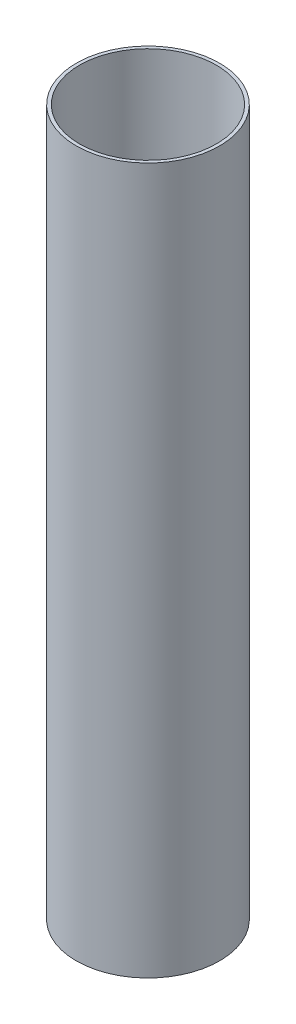
ISO-10303-21;
HEADER;
FILE_DESCRIPTION(('STEP AP214'),'2;1');
FILE_NAME('part.step','',(''),(''),'','','');
FILE_SCHEMA(('AUTOMOTIVE_DESIGN { 1 0 10303 214 1 1 1 1 }'));
ENDSEC;
DATA;
#1=APPLICATION_CONTEXT('core data for automotive mechanical design processes');
#2=APPLICATION_PROTOCOL_DEFINITION('international standard','automotive_design',2000,#1);
#3=PRODUCT_CONTEXT('',#1,'mechanical');
#4=PRODUCT('Part','Part','',(#3));
#5=PRODUCT_RELATED_PRODUCT_CATEGORY('part','',(#4));
#6=PRODUCT_DEFINITION_FORMATION('','',#4);
#7=PRODUCT_DEFINITION_CONTEXT('part definition',#1,'design');
#8=PRODUCT_DEFINITION('design','',#6,#7);
#9=PRODUCT_DEFINITION_SHAPE('','',#8);
#10=(LENGTH_UNIT() NAMED_UNIT(*) SI_UNIT(.MILLI.,.METRE.));
#11=(NAMED_UNIT(*) PLANE_ANGLE_UNIT() SI_UNIT($,.RADIAN.));
#12=(NAMED_UNIT(*) SI_UNIT($,.STERADIAN.) SOLID_ANGLE_UNIT());
#13=UNCERTAINTY_MEASURE_WITH_UNIT(LENGTH_MEASURE(1.E-05),#10,'distance_accuracy_value','');
#14=(GEOMETRIC_REPRESENTATION_CONTEXT(3) GLOBAL_UNCERTAINTY_ASSIGNED_CONTEXT((#13)) GLOBAL_UNIT_ASSIGNED_CONTEXT((#10,
#11,#12)) REPRESENTATION_CONTEXT('',''));
#15=CARTESIAN_POINT('',(0.,0.,0.));
#16=DIRECTION('',(0.,0.,1.));
#17=DIRECTION('',(1.,0.,0.));
#18=AXIS2_PLACEMENT_3D('',#15,#16,#17);
#19=CARTESIAN_POINT('',(0.,320.,0.));
#20=DIRECTION('',(0.,-1.,0.));
#21=DIRECTION('',(0.,0.,-1.));
#22=AXIS2_PLACEMENT_3D('',#19,#20,#21);
#23=CYLINDRICAL_SURFACE('',#22,32.5);
#24=CARTESIAN_POINT('',(0.,320.,0.));
#25=DIRECTION('',(0.,1.,0.));
#26=DIRECTION('',(0.,0.,1.));
#27=AXIS2_PLACEMENT_3D('',#24,#25,#26);
#28=CIRCLE('',#27,32.5);
#29=CARTESIAN_POINT('',(0.,320.,32.5));
#30=VERTEX_POINT('',#29);
#31=EDGE_CURVE('E10',#30,#30,#28,.T.);
#32=ORIENTED_EDGE('',*,*,#31,.F.);
#33=EDGE_LOOP('',(#32));
#34=FACE_BOUND('',#33,.T.);
#35=CARTESIAN_POINT('',(0.,0.,0.));
#36=DIRECTION('',(0.,1.,0.));
#37=DIRECTION('',(0.,0.,1.));
#38=AXIS2_PLACEMENT_3D('',#35,#36,#37);
#39=CIRCLE('',#38,32.5);
#40=CARTESIAN_POINT('',(0.,0.,32.5));
#41=VERTEX_POINT('',#40);
#42=EDGE_CURVE('E41',#41,#41,#39,.T.);
#43=ORIENTED_EDGE('',*,*,#42,.T.);
#44=EDGE_LOOP('',(#43));
#45=FACE_BOUND('',#44,.T.);
#46=ADVANCED_FACE('F38',(#34,#45),#23,.T.);
#47=CARTESIAN_POINT('',(0.,320.,0.));
#48=DIRECTION('',(0.,1.,0.));
#49=DIRECTION('',(0.,0.,1.));
#50=AXIS2_PLACEMENT_3D('',#47,#48,#49);
#51=PLANE('',#50);
#52=CARTESIAN_POINT('',(0.,320.,0.));
#53=DIRECTION('',(0.,1.,0.));
#54=DIRECTION('',(0.,0.,1.));
#55=AXIS2_PLACEMENT_3D('',#52,#53,#54);
#56=CIRCLE('',#55,31.);
#57=CARTESIAN_POINT('',(0.,320.,31.));
#58=VERTEX_POINT('',#57);
#59=EDGE_CURVE('E50',#58,#58,#56,.T.);
#60=ORIENTED_EDGE('',*,*,#59,.F.);
#61=EDGE_LOOP('',(#60));
#62=FACE_BOUND('',#61,.T.);
#63=ORIENTED_EDGE('',*,*,#31,.T.);
#64=EDGE_LOOP('',(#63));
#65=FACE_BOUND('',#64,.T.);
#66=ADVANCED_FACE('F65',(#62,#65),#51,.T.);
#67=CARTESIAN_POINT('',(0.,0.,0.));
#68=DIRECTION('',(0.,1.,0.));
#69=DIRECTION('',(0.,0.,1.));
#70=AXIS2_PLACEMENT_3D('',#67,#68,#69);
#71=PLANE('',#70);
#72=CARTESIAN_POINT('',(0.,0.,0.));
#73=DIRECTION('',(0.,1.,0.));
#74=DIRECTION('',(0.,0.,1.));
#75=AXIS2_PLACEMENT_3D('',#72,#73,#74);
#76=CIRCLE('',#75,31.);
#77=CARTESIAN_POINT('',(0.,0.,31.));
#78=VERTEX_POINT('',#77);
#79=EDGE_CURVE('E48',#78,#78,#76,.T.);
#80=ORIENTED_EDGE('',*,*,#79,.T.);
#81=EDGE_LOOP('',(#80));
#82=FACE_BOUND('',#81,.T.);
#83=ORIENTED_EDGE('',*,*,#42,.F.);
#84=EDGE_LOOP('',(#83));
#85=FACE_BOUND('',#84,.T.);
#86=ADVANCED_FACE('F56',(#82,#85),#71,.F.);
#87=CARTESIAN_POINT('',(0.,0.,0.));
#88=DIRECTION('',(0.,1.,0.));
#89=DIRECTION('',(0.,0.,1.));
#90=AXIS2_PLACEMENT_3D('',#87,#88,#89);
#91=CYLINDRICAL_SURFACE('',#90,31.);
#92=ORIENTED_EDGE('',*,*,#79,.F.);
#93=EDGE_LOOP('',(#92));
#94=FACE_BOUND('',#93,.T.);
#95=ORIENTED_EDGE('',*,*,#59,.T.);
#96=EDGE_LOOP('',(#95));
#97=FACE_BOUND('',#96,.T.);
#98=ADVANCED_FACE('F59',(#94,#97),#91,.F.);
#99=CLOSED_SHELL('',(#46,#66,#86,#98));
#100=MANIFOLD_SOLID_BREP('B2',#99);
#101=ADVANCED_BREP_SHAPE_REPRESENTATION('',(#18,#100),#14);
#102=SHAPE_DEFINITION_REPRESENTATION(#9,#101);
ENDSEC;
END-ISO-10303-21;
